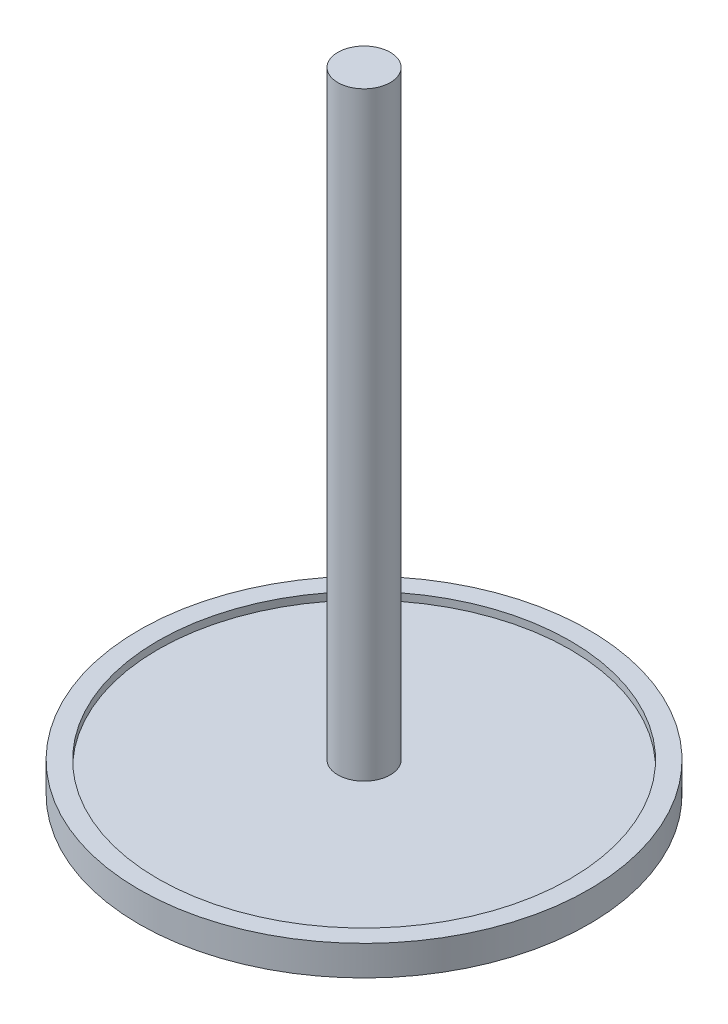
ISO-10303-21;
HEADER;
FILE_DESCRIPTION(('STEP AP214'),'2;1');
FILE_NAME('part.step','',(''),(''),'','','');
FILE_SCHEMA(('AUTOMOTIVE_DESIGN { 1 0 10303 214 1 1 1 1 }'));
ENDSEC;
DATA;
#1=APPLICATION_CONTEXT('core data for automotive mechanical design processes');
#2=APPLICATION_PROTOCOL_DEFINITION('international standard','automotive_design',2000,#1);
#3=PRODUCT_CONTEXT('',#1,'mechanical');
#4=PRODUCT('Part','Part','',(#3));
#5=PRODUCT_RELATED_PRODUCT_CATEGORY('part','',(#4));
#6=PRODUCT_DEFINITION_FORMATION('','',#4);
#7=PRODUCT_DEFINITION_CONTEXT('part definition',#1,'design');
#8=PRODUCT_DEFINITION('design','',#6,#7);
#9=PRODUCT_DEFINITION_SHAPE('','',#8);
#10=(LENGTH_UNIT() NAMED_UNIT(*) SI_UNIT(.MILLI.,.METRE.));
#11=(NAMED_UNIT(*) PLANE_ANGLE_UNIT() SI_UNIT($,.RADIAN.));
#12=(NAMED_UNIT(*) SI_UNIT($,.STERADIAN.) SOLID_ANGLE_UNIT());
#13=UNCERTAINTY_MEASURE_WITH_UNIT(LENGTH_MEASURE(1.E-05),#10,'distance_accuracy_value','');
#14=(GEOMETRIC_REPRESENTATION_CONTEXT(3) GLOBAL_UNCERTAINTY_ASSIGNED_CONTEXT((#13)) GLOBAL_UNIT_ASSIGNED_CONTEXT((#10,
#11,#12)) REPRESENTATION_CONTEXT('',''));
#15=CARTESIAN_POINT('',(0.,0.,0.));
#16=DIRECTION('',(0.,0.,1.));
#17=DIRECTION('',(1.,0.,0.));
#18=AXIS2_PLACEMENT_3D('',#15,#16,#17);
#19=CARTESIAN_POINT('',(0.,20.,0.));
#20=DIRECTION('',(0.,-1.,0.));
#21=DIRECTION('',(0.,0.,-1.));
#22=AXIS2_PLACEMENT_3D('',#19,#20,#21);
#23=CYLINDRICAL_SURFACE('',#22,150.);
#24=CARTESIAN_POINT('',(0.,20.,0.));
#25=DIRECTION('',(0.,1.,0.));
#26=DIRECTION('',(0.,0.,1.));
#27=AXIS2_PLACEMENT_3D('',#24,#25,#26);
#28=CIRCLE('',#27,150.);
#29=CARTESIAN_POINT('',(0.,20.,150.));
#30=VERTEX_POINT('',#29);
#31=EDGE_CURVE('E58',#30,#30,#28,.T.);
#32=ORIENTED_EDGE('',*,*,#31,.F.);
#33=EDGE_LOOP('',(#32));
#34=FACE_BOUND('',#33,.T.);
#35=CARTESIAN_POINT('',(0.,0.,0.));
#36=DIRECTION('',(0.,1.,0.));
#37=DIRECTION('',(0.,0.,1.));
#38=AXIS2_PLACEMENT_3D('',#35,#36,#37);
#39=CIRCLE('',#38,150.);
#40=CARTESIAN_POINT('',(0.,0.,150.));
#41=VERTEX_POINT('',#40);
#42=EDGE_CURVE('E63',#41,#41,#39,.T.);
#43=ORIENTED_EDGE('',*,*,#42,.T.);
#44=EDGE_LOOP('',(#43));
#45=FACE_BOUND('',#44,.T.);
#46=ADVANCED_FACE('F45',(#34,#45),#23,.T.);
#47=CARTESIAN_POINT('',(0.,20.,0.));
#48=DIRECTION('',(0.,1.,0.));
#49=DIRECTION('',(0.,0.,1.));
#50=AXIS2_PLACEMENT_3D('',#47,#48,#49);
#51=PLANE('',#50);
#52=CARTESIAN_POINT('',(0.,20.,0.));
#53=DIRECTION('',(0.,1.,0.));
#54=DIRECTION('',(0.,0.,1.));
#55=AXIS2_PLACEMENT_3D('',#52,#53,#54);
#56=CIRCLE('',#55,137.5);
#57=CARTESIAN_POINT('',(0.,20.,137.5));
#58=VERTEX_POINT('',#57);
#59=EDGE_CURVE('E53',#58,#58,#56,.T.);
#60=ORIENTED_EDGE('',*,*,#59,.F.);
#61=EDGE_LOOP('',(#60));
#62=FACE_BOUND('',#61,.T.);
#63=ORIENTED_EDGE('',*,*,#31,.T.);
#64=EDGE_LOOP('',(#63));
#65=FACE_BOUND('',#64,.T.);
#66=ADVANCED_FACE('F74',(#62,#65),#51,.T.);
#67=CARTESIAN_POINT('',(0.,0.,0.));
#68=DIRECTION('',(0.,1.,0.));
#69=DIRECTION('',(0.,0.,1.));
#70=AXIS2_PLACEMENT_3D('',#67,#68,#69);
#71=PLANE('',#70);
#72=ORIENTED_EDGE('',*,*,#42,.F.);
#73=EDGE_LOOP('',(#72));
#74=FACE_BOUND('',#73,.T.);
#75=ADVANCED_FACE('F71',(#74),#71,.F.);
#76=CARTESIAN_POINT('',(0.,15.,0.));
#77=DIRECTION('',(0.,1.,0.));
#78=DIRECTION('',(0.,0.,1.));
#79=AXIS2_PLACEMENT_3D('',#76,#77,#78);
#80=CYLINDRICAL_SURFACE('',#79,137.5);
#81=CARTESIAN_POINT('',(0.,15.,0.));
#82=DIRECTION('',(0.,1.,0.));
#83=DIRECTION('',(0.,0.,1.));
#84=AXIS2_PLACEMENT_3D('',#81,#82,#83);
#85=CIRCLE('',#84,137.5);
#86=CARTESIAN_POINT('',(0.,15.,137.5));
#87=VERTEX_POINT('',#86);
#88=EDGE_CURVE('E11',#87,#87,#85,.T.);
#89=ORIENTED_EDGE('',*,*,#88,.F.);
#90=EDGE_LOOP('',(#89));
#91=FACE_BOUND('',#90,.T.);
#92=ORIENTED_EDGE('',*,*,#59,.T.);
#93=EDGE_LOOP('',(#92));
#94=FACE_BOUND('',#93,.T.);
#95=ADVANCED_FACE('F73',(#91,#94),#80,.F.);
#96=CARTESIAN_POINT('',(0.,15.,0.));
#97=DIRECTION('',(0.,1.,0.));
#98=DIRECTION('',(0.,0.,1.));
#99=AXIS2_PLACEMENT_3D('',#96,#97,#98);
#100=PLANE('',#99);
#101=ORIENTED_EDGE('',*,*,#88,.T.);
#102=EDGE_LOOP('',(#101));
#103=FACE_BOUND('',#102,.T.);
#104=ADVANCED_FACE('F47',(#103),#100,.T.);
#105=CLOSED_SHELL('',(#46,#66,#75,#95,#104));
#106=MANIFOLD_SOLID_BREP('B2',#105);
#107=CARTESIAN_POINT('',(0.,420.,0.));
#108=DIRECTION('',(0.,1.,0.));
#109=DIRECTION('',(0.,0.,1.));
#110=AXIS2_PLACEMENT_3D('',#107,#108,#109);
#111=PLANE('',#110);
#112=CARTESIAN_POINT('',(0.,420.,0.));
#113=DIRECTION('',(0.,1.,0.));
#114=DIRECTION('',(0.,0.,1.));
#115=AXIS2_PLACEMENT_3D('',#112,#113,#114);
#116=CIRCLE('',#115,17.5);
#117=CARTESIAN_POINT('',(0.,420.,17.5));
#118=VERTEX_POINT('',#117);
#119=EDGE_CURVE('E44',#118,#118,#116,.T.);
#120=ORIENTED_EDGE('',*,*,#119,.T.);
#121=EDGE_LOOP('',(#120));
#122=FACE_BOUND('',#121,.T.);
#123=ADVANCED_FACE('F120',(#122),#111,.T.);
#124=CARTESIAN_POINT('',(0.,420.,0.));
#125=DIRECTION('',(0.,-1.,0.));
#126=DIRECTION('',(0.,0.,-1.));
#127=AXIS2_PLACEMENT_3D('',#124,#125,#126);
#128=CYLINDRICAL_SURFACE('',#127,17.5);
#129=ORIENTED_EDGE('',*,*,#119,.F.);
#130=EDGE_LOOP('',(#129));
#131=FACE_BOUND('',#130,.T.);
#132=CARTESIAN_POINT('',(0.,20.,0.));
#133=DIRECTION('',(0.,1.,0.));
#134=DIRECTION('',(0.,0.,1.));
#135=AXIS2_PLACEMENT_3D('',#132,#133,#134);
#136=CIRCLE('',#135,17.5);
#137=CARTESIAN_POINT('',(0.,20.,17.5));
#138=VERTEX_POINT('',#137);
#139=EDGE_CURVE('E127',#138,#138,#136,.T.);
#140=ORIENTED_EDGE('',*,*,#139,.T.);
#141=EDGE_LOOP('',(#140));
#142=FACE_BOUND('',#141,.T.);
#143=ADVANCED_FACE('F122',(#131,#142),#128,.T.);
#144=CARTESIAN_POINT('',(0.,20.,0.));
#145=DIRECTION('',(0.,1.,0.));
#146=DIRECTION('',(0.,0.,1.));
#147=AXIS2_PLACEMENT_3D('',#144,#145,#146);
#148=PLANE('',#147);
#149=ORIENTED_EDGE('',*,*,#139,.F.);
#150=EDGE_LOOP('',(#149));
#151=FACE_BOUND('',#150,.T.);
#152=ADVANCED_FACE('F134',(#151),#148,.F.);
#153=CLOSED_SHELL('',(#123,#143,#152));
#154=MANIFOLD_SOLID_BREP('B6',#153);
#155=ADVANCED_BREP_SHAPE_REPRESENTATION('',(#18,#106,#154),#14);
#156=SHAPE_DEFINITION_REPRESENTATION(#9,#155);
ENDSEC;
END-ISO-10303-21;
